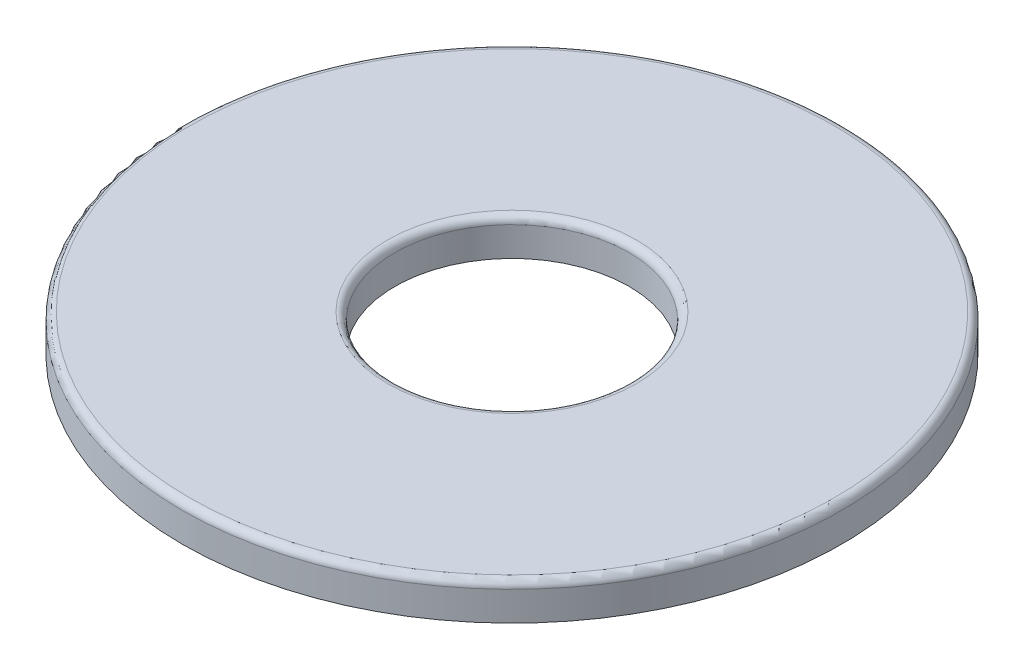
ISO-10303-21;
HEADER;
FILE_DESCRIPTION(('STEP AP214'),'2;1');
FILE_NAME('part.step','',(''),(''),'','','');
FILE_SCHEMA(('AUTOMOTIVE_DESIGN { 1 0 10303 214 1 1 1 1 }'));
ENDSEC;
DATA;
#1=APPLICATION_CONTEXT('core data for automotive mechanical design processes');
#2=APPLICATION_PROTOCOL_DEFINITION('international standard','automotive_design',2000,#1);
#3=PRODUCT_CONTEXT('',#1,'mechanical');
#4=PRODUCT('Part','Part','',(#3));
#5=PRODUCT_RELATED_PRODUCT_CATEGORY('part','',(#4));
#6=PRODUCT_DEFINITION_FORMATION('','',#4);
#7=PRODUCT_DEFINITION_CONTEXT('part definition',#1,'design');
#8=PRODUCT_DEFINITION('design','',#6,#7);
#9=PRODUCT_DEFINITION_SHAPE('','',#8);
#10=(LENGTH_UNIT() NAMED_UNIT(*) SI_UNIT(.MILLI.,.METRE.));
#11=(NAMED_UNIT(*) PLANE_ANGLE_UNIT() SI_UNIT($,.RADIAN.));
#12=(NAMED_UNIT(*) SI_UNIT($,.STERADIAN.) SOLID_ANGLE_UNIT());
#13=UNCERTAINTY_MEASURE_WITH_UNIT(LENGTH_MEASURE(1.E-05),#10,'distance_accuracy_value','');
#14=(GEOMETRIC_REPRESENTATION_CONTEXT(3) GLOBAL_UNCERTAINTY_ASSIGNED_CONTEXT((#13)) GLOBAL_UNIT_ASSIGNED_CONTEXT((#10,
#11,#12)) REPRESENTATION_CONTEXT('',''));
#15=CARTESIAN_POINT('',(0.,0.,0.));
#16=DIRECTION('',(0.,0.,1.));
#17=DIRECTION('',(1.,0.,0.));
#18=AXIS2_PLACEMENT_3D('',#15,#16,#17);
#19=CARTESIAN_POINT('',(0.,0.5,0.));
#20=DIRECTION('',(0.,1.,0.));
#21=DIRECTION('',(0.,0.,1.));
#22=AXIS2_PLACEMENT_3D('',#19,#20,#21);
#23=PLANE('',#22);
#24=CARTESIAN_POINT('',(0.,0.5,0.));
#25=DIRECTION('',(0.,1.,0.));
#26=DIRECTION('',(0.,0.,1.));
#27=AXIS2_PLACEMENT_3D('',#24,#25,#26);
#28=CIRCLE('',#27,1.7);
#29=CARTESIAN_POINT('',(0.,0.5,1.7));
#30=VERTEX_POINT('',#29);
#31=EDGE_CURVE('E48',#30,#30,#28,.F.);
#32=ORIENTED_EDGE('',*,*,#31,.T.);
#33=EDGE_LOOP('',(#32));
#34=FACE_BOUND('',#33,.T.);
#35=CARTESIAN_POINT('',(0.,0.5,0.));
#36=DIRECTION('',(0.,1.,0.));
#37=DIRECTION('',(0.,0.,1.));
#38=AXIS2_PLACEMENT_3D('',#35,#36,#37);
#39=CIRCLE('',#38,4.4);
#40=CARTESIAN_POINT('',(0.,0.5,4.4));
#41=VERTEX_POINT('',#40);
#42=EDGE_CURVE('E53',#41,#41,#39,.T.);
#43=ORIENTED_EDGE('',*,*,#42,.T.);
#44=EDGE_LOOP('',(#43));
#45=FACE_BOUND('',#44,.T.);
#46=ADVANCED_FACE('F40',(#34,#45),#23,.T.);
#47=CARTESIAN_POINT('',(0.,0.,0.));
#48=DIRECTION('',(0.,1.,0.));
#49=DIRECTION('',(0.,0.,1.));
#50=AXIS2_PLACEMENT_3D('',#47,#48,#49);
#51=PLANE('',#50);
#52=CARTESIAN_POINT('',(0.,0.,0.));
#53=DIRECTION('',(0.,1.,0.));
#54=DIRECTION('',(0.,0.,1.));
#55=AXIS2_PLACEMENT_3D('',#52,#53,#54);
#56=CIRCLE('',#55,4.5);
#57=CARTESIAN_POINT('',(0.,0.,4.5));
#58=VERTEX_POINT('',#57);
#59=EDGE_CURVE('E64',#58,#58,#56,.T.);
#60=ORIENTED_EDGE('',*,*,#59,.F.);
#61=EDGE_LOOP('',(#60));
#62=FACE_BOUND('',#61,.T.);
#63=CARTESIAN_POINT('',(0.,0.,0.));
#64=DIRECTION('',(0.,1.,0.));
#65=DIRECTION('',(0.,0.,1.));
#66=AXIS2_PLACEMENT_3D('',#63,#64,#65);
#67=CIRCLE('',#66,1.6);
#68=CARTESIAN_POINT('',(0.,0.,1.6));
#69=VERTEX_POINT('',#68);
#70=EDGE_CURVE('E68',#69,#69,#67,.T.);
#71=ORIENTED_EDGE('',*,*,#70,.T.);
#72=EDGE_LOOP('',(#71));
#73=FACE_BOUND('',#72,.T.);
#74=ADVANCED_FACE('F73',(#62,#73),#51,.F.);
#75=CARTESIAN_POINT('',(0.,0.5,0.));
#76=DIRECTION('',(0.,-1.,0.));
#77=DIRECTION('',(0.,0.,-1.));
#78=AXIS2_PLACEMENT_3D('',#75,#76,#77);
#79=CYLINDRICAL_SURFACE('',#78,4.5);
#80=CARTESIAN_POINT('',(0.,0.4,0.));
#81=DIRECTION('',(0.,1.,0.));
#82=DIRECTION('',(0.,0.,1.));
#83=AXIS2_PLACEMENT_3D('',#80,#81,#82);
#84=CIRCLE('',#83,4.5);
#85=CARTESIAN_POINT('',(0.,0.4,4.5));
#86=VERTEX_POINT('',#85);
#87=EDGE_CURVE('E10',#86,#86,#84,.F.);
#88=ORIENTED_EDGE('',*,*,#87,.T.);
#89=EDGE_LOOP('',(#88));
#90=FACE_BOUND('',#89,.T.);
#91=ORIENTED_EDGE('',*,*,#59,.T.);
#92=EDGE_LOOP('',(#91));
#93=FACE_BOUND('',#92,.T.);
#94=ADVANCED_FACE('F78',(#90,#93),#79,.T.);
#95=CARTESIAN_POINT('',(0.,0.5,0.));
#96=DIRECTION('',(0.,-1.,0.));
#97=DIRECTION('',(0.,0.,-1.));
#98=AXIS2_PLACEMENT_3D('',#95,#96,#97);
#99=CYLINDRICAL_SURFACE('',#98,1.6);
#100=CARTESIAN_POINT('',(0.,0.4,0.));
#101=DIRECTION('',(0.,1.,0.));
#102=DIRECTION('',(0.,0.,1.));
#103=AXIS2_PLACEMENT_3D('',#100,#101,#102);
#104=CIRCLE('',#103,1.6);
#105=CARTESIAN_POINT('',(0.,0.4,1.6));
#106=VERTEX_POINT('',#105);
#107=EDGE_CURVE('E58',#106,#106,#104,.T.);
#108=ORIENTED_EDGE('',*,*,#107,.T.);
#109=EDGE_LOOP('',(#108));
#110=FACE_BOUND('',#109,.T.);
#111=ORIENTED_EDGE('',*,*,#70,.F.);
#112=EDGE_LOOP('',(#111));
#113=FACE_BOUND('',#112,.T.);
#114=ADVANCED_FACE('F75',(#110,#113),#99,.F.);
#115=CARTESIAN_POINT('',(0.,0.4,0.));
#116=DIRECTION('',(0.,1.,0.));
#117=DIRECTION('',(0.,0.,1.));
#118=AXIS2_PLACEMENT_3D('',#115,#116,#117);
#119=TOROIDAL_SURFACE('',#118,1.7,0.1);
#120=ORIENTED_EDGE('',*,*,#31,.F.);
#121=EDGE_LOOP('',(#120));
#122=FACE_BOUND('',#121,.T.);
#123=ORIENTED_EDGE('',*,*,#107,.F.);
#124=EDGE_LOOP('',(#123));
#125=FACE_BOUND('',#124,.T.);
#126=ADVANCED_FACE('F77',(#122,#125),#119,.T.);
#127=CARTESIAN_POINT('',(0.,0.4,0.));
#128=DIRECTION('',(0.,1.,0.));
#129=DIRECTION('',(0.,0.,1.));
#130=AXIS2_PLACEMENT_3D('',#127,#128,#129);
#131=TOROIDAL_SURFACE('',#130,4.4,0.1);
#132=ORIENTED_EDGE('',*,*,#87,.F.);
#133=EDGE_LOOP('',(#132));
#134=FACE_BOUND('',#133,.T.);
#135=ORIENTED_EDGE('',*,*,#42,.F.);
#136=EDGE_LOOP('',(#135));
#137=FACE_BOUND('',#136,.T.);
#138=ADVANCED_FACE('F42',(#134,#137),#131,.T.);
#139=CLOSED_SHELL('',(#46,#74,#94,#114,#126,#138));
#140=MANIFOLD_SOLID_BREP('B2',#139);
#141=ADVANCED_BREP_SHAPE_REPRESENTATION('',(#18,#140),#14);
#142=SHAPE_DEFINITION_REPRESENTATION(#9,#141);
ENDSEC;
END-ISO-10303-21;
